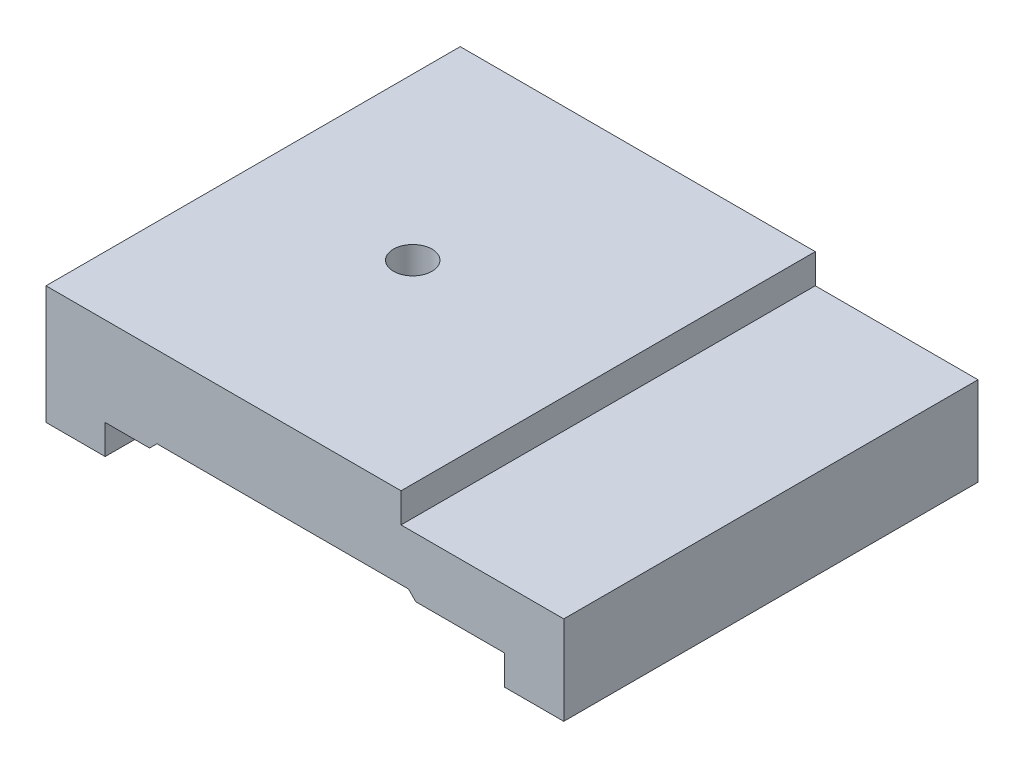
ISO-10303-21;
HEADER;
FILE_DESCRIPTION(('STEP AP214'),'2;1');
FILE_NAME('part.step','',(''),(''),'','','');
FILE_SCHEMA(('AUTOMOTIVE_DESIGN { 1 0 10303 214 1 1 1 1 }'));
ENDSEC;
DATA;
#1=APPLICATION_CONTEXT('core data for automotive mechanical design processes');
#2=APPLICATION_PROTOCOL_DEFINITION('international standard','automotive_design',2000,#1);
#3=PRODUCT_CONTEXT('',#1,'mechanical');
#4=PRODUCT('Part','Part','',(#3));
#5=PRODUCT_RELATED_PRODUCT_CATEGORY('part','',(#4));
#6=PRODUCT_DEFINITION_FORMATION('','',#4);
#7=PRODUCT_DEFINITION_CONTEXT('part definition',#1,'design');
#8=PRODUCT_DEFINITION('design','',#6,#7);
#9=PRODUCT_DEFINITION_SHAPE('','',#8);
#10=(LENGTH_UNIT() NAMED_UNIT(*) SI_UNIT(.MILLI.,.METRE.));
#11=(NAMED_UNIT(*) PLANE_ANGLE_UNIT() SI_UNIT($,.RADIAN.));
#12=(NAMED_UNIT(*) SI_UNIT($,.STERADIAN.) SOLID_ANGLE_UNIT());
#13=UNCERTAINTY_MEASURE_WITH_UNIT(LENGTH_MEASURE(1.E-05),#10,'distance_accuracy_value','');
#14=(GEOMETRIC_REPRESENTATION_CONTEXT(3) GLOBAL_UNCERTAINTY_ASSIGNED_CONTEXT((#13)) GLOBAL_UNIT_ASSIGNED_CONTEXT((#10,
#11,#12)) REPRESENTATION_CONTEXT('',''));
#15=CARTESIAN_POINT('',(0.,0.,0.));
#16=DIRECTION('',(0.,0.,1.));
#17=DIRECTION('',(1.,0.,0.));
#18=AXIS2_PLACEMENT_3D('',#15,#16,#17);
#19=CARTESIAN_POINT('',(0.,0.,0.));
#20=DIRECTION('',(0.,1.,0.));
#21=DIRECTION('',(0.,0.,1.));
#22=AXIS2_PLACEMENT_3D('',#19,#20,#21);
#23=PLANE('',#22);
#24=DIRECTION('',(-1.,0.,0.));
#25=VECTOR('',#24,1.);
#26=CARTESIAN_POINT('',(55.5625,0.,-44.45));
#27=LINE('',#26,#25);
#28=CARTESIAN_POINT('',(-42.8625,0.,-44.45));
#29=VERTEX_POINT('',#28);
#30=CARTESIAN_POINT('',(-55.5625,0.,-44.45));
#31=VERTEX_POINT('',#30);
#32=EDGE_CURVE('E240',#29,#31,#27,.T.);
#33=ORIENTED_EDGE('',*,*,#32,.F.);
#34=DIRECTION('',(0.,0.,1.));
#35=VECTOR('',#34,1.);
#36=CARTESIAN_POINT('',(-42.8625,0.,-44.45));
#37=LINE('',#36,#35);
#38=CARTESIAN_POINT('',(-42.8625,0.,44.45));
#39=VERTEX_POINT('',#38);
#40=EDGE_CURVE('E161',#29,#39,#37,.T.);
#41=ORIENTED_EDGE('',*,*,#40,.T.);
#42=DIRECTION('',(1.,0.,0.));
#43=VECTOR('',#42,1.);
#44=CARTESIAN_POINT('',(55.5625,0.,44.45));
#45=LINE('',#44,#43);
#46=CARTESIAN_POINT('',(-55.5625,0.,44.45));
#47=VERTEX_POINT('',#46);
#48=EDGE_CURVE('E234',#47,#39,#45,.T.);
#49=ORIENTED_EDGE('',*,*,#48,.F.);
#50=DIRECTION('',(0.,0.,1.));
#51=VECTOR('',#50,1.);
#52=CARTESIAN_POINT('',(-55.5625,0.,44.45));
#53=LINE('',#52,#51);
#54=EDGE_CURVE('E163',#31,#47,#53,.T.);
#55=ORIENTED_EDGE('',*,*,#54,.F.);
#56=EDGE_LOOP('',(#33,#41,#49,#55));
#57=FACE_BOUND('',#56,.T.);
#58=ADVANCED_FACE('F34',(#57),#23,.F.);
#59=CARTESIAN_POINT('',(-55.5625,25.4,44.45));
#60=DIRECTION('',(1.,0.,0.));
#61=DIRECTION('',(0.,0.,-1.));
#62=AXIS2_PLACEMENT_3D('',#59,#60,#61);
#63=PLANE('',#62);
#64=ORIENTED_EDGE('',*,*,#54,.T.);
#65=DIRECTION('',(0.,-1.,0.));
#66=VECTOR('',#65,1.);
#67=CARTESIAN_POINT('',(-55.5625,25.4,44.45));
#68=LINE('',#67,#66);
#69=CARTESIAN_POINT('',(-55.5625,25.4,44.45));
#70=VERTEX_POINT('',#69);
#71=EDGE_CURVE('E11',#70,#47,#68,.T.);
#72=ORIENTED_EDGE('',*,*,#71,.F.);
#73=DIRECTION('',(0.,0.,1.));
#74=VECTOR('',#73,1.);
#75=CARTESIAN_POINT('',(-55.5625,25.4,44.45));
#76=LINE('',#75,#74);
#77=CARTESIAN_POINT('',(-55.5625,25.4,-44.45));
#78=VERTEX_POINT('',#77);
#79=EDGE_CURVE('E222',#78,#70,#76,.T.);
#80=ORIENTED_EDGE('',*,*,#79,.F.);
#81=DIRECTION('',(0.,-1.,0.));
#82=VECTOR('',#81,1.);
#83=CARTESIAN_POINT('',(-55.5625,25.4,-44.45));
#84=LINE('',#83,#82);
#85=EDGE_CURVE('E230',#78,#31,#84,.T.);
#86=ORIENTED_EDGE('',*,*,#85,.T.);
#87=EDGE_LOOP('',(#64,#72,#80,#86));
#88=FACE_BOUND('',#87,.T.);
#89=ADVANCED_FACE('F36',(#88),#63,.F.);
#90=CARTESIAN_POINT('',(55.5625,25.4,44.45));
#91=DIRECTION('',(0.,0.,-1.));
#92=DIRECTION('',(-1.,0.,0.));
#93=AXIS2_PLACEMENT_3D('',#90,#91,#92);
#94=PLANE('',#93);
#95=DIRECTION('',(0.,-1.,0.));
#96=VECTOR('',#95,1.);
#97=CARTESIAN_POINT('',(55.5625,25.4,44.45));
#98=LINE('',#97,#96);
#99=CARTESIAN_POINT('',(55.5625,19.05,44.45));
#100=VERTEX_POINT('',#99);
#101=CARTESIAN_POINT('',(55.5625,0.,44.45));
#102=VERTEX_POINT('',#101);
#103=EDGE_CURVE('E42',#100,#102,#98,.T.);
#104=ORIENTED_EDGE('',*,*,#103,.F.);
#105=DIRECTION('',(1.,0.,0.));
#106=VECTOR('',#105,1.);
#107=CARTESIAN_POINT('',(55.5625,19.05,44.45));
#108=LINE('',#107,#106);
#109=CARTESIAN_POINT('',(20.6375,19.05,44.45));
#110=VERTEX_POINT('',#109);
#111=EDGE_CURVE('E154',#110,#100,#108,.T.);
#112=ORIENTED_EDGE('',*,*,#111,.F.);
#113=DIRECTION('',(0.,-1.,0.));
#114=VECTOR('',#113,1.);
#115=CARTESIAN_POINT('',(20.6375,25.4,44.45));
#116=LINE('',#115,#114);
#117=CARTESIAN_POINT('',(20.6375,25.4,44.45));
#118=VERTEX_POINT('',#117);
#119=EDGE_CURVE('E137',#118,#110,#116,.T.);
#120=ORIENTED_EDGE('',*,*,#119,.F.);
#121=DIRECTION('',(1.,0.,0.));
#122=VECTOR('',#121,1.);
#123=CARTESIAN_POINT('',(55.5625,25.4,44.45));
#124=LINE('',#123,#122);
#125=EDGE_CURVE('E225',#70,#118,#124,.T.);
#126=ORIENTED_EDGE('',*,*,#125,.F.);
#127=ORIENTED_EDGE('',*,*,#71,.T.);
#128=ORIENTED_EDGE('',*,*,#48,.T.);
#129=DIRECTION('',(0.,-1.,0.));
#130=VECTOR('',#129,1.);
#131=CARTESIAN_POINT('',(-42.8625,0.,44.45));
#132=LINE('',#131,#130);
#133=CARTESIAN_POINT('',(-42.8625,6.35,44.45));
#134=VERTEX_POINT('',#133);
#135=EDGE_CURVE('E168',#134,#39,#132,.T.);
#136=ORIENTED_EDGE('',*,*,#135,.F.);
#137=DIRECTION('',(-1.,0.,0.));
#138=VECTOR('',#137,1.);
#139=CARTESIAN_POINT('',(-42.8625,6.35,44.45));
#140=LINE('',#139,#138);
#141=CARTESIAN_POINT('',(-33.3375,6.35,44.45));
#142=VERTEX_POINT('',#141);
#143=EDGE_CURVE('E203',#142,#134,#140,.T.);
#144=ORIENTED_EDGE('',*,*,#143,.F.);
#145=DIRECTION('',(-0.707106781186546,-0.707106781186549,0.));
#146=VECTOR('',#145,1.);
#147=CARTESIAN_POINT('',(-33.3375,6.35,44.45));
#148=LINE('',#147,#146);
#149=CARTESIAN_POINT('',(-31.75,7.9375,44.45));
#150=VERTEX_POINT('',#149);
#151=EDGE_CURVE('E200',#150,#142,#148,.T.);
#152=ORIENTED_EDGE('',*,*,#151,.F.);
#153=DIRECTION('',(-1.,0.,0.));
#154=VECTOR('',#153,1.);
#155=CARTESIAN_POINT('',(-31.75,7.9375,44.45));
#156=LINE('',#155,#154);
#157=CARTESIAN_POINT('',(22.225,7.9375,44.45));
#158=VERTEX_POINT('',#157);
#159=EDGE_CURVE('E197',#158,#150,#156,.T.);
#160=ORIENTED_EDGE('',*,*,#159,.F.);
#161=DIRECTION('',(-0.707106781186546,0.707106781186549,0.));
#162=VECTOR('',#161,1.);
#163=CARTESIAN_POINT('',(22.225,7.9375,44.45));
#164=LINE('',#163,#162);
#165=CARTESIAN_POINT('',(23.8125,6.35,44.45));
#166=VERTEX_POINT('',#165);
#167=EDGE_CURVE('E194',#166,#158,#164,.T.);
#168=ORIENTED_EDGE('',*,*,#167,.F.);
#169=DIRECTION('',(-1.,0.,0.));
#170=VECTOR('',#169,1.);
#171=CARTESIAN_POINT('',(23.8125,6.35,44.45));
#172=LINE('',#171,#170);
#173=CARTESIAN_POINT('',(42.8625,6.35,44.45));
#174=VERTEX_POINT('',#173);
#175=EDGE_CURVE('E190',#174,#166,#172,.T.);
#176=ORIENTED_EDGE('',*,*,#175,.F.);
#177=DIRECTION('',(0.,1.,0.));
#178=VECTOR('',#177,1.);
#179=CARTESIAN_POINT('',(42.8625,6.35,44.45));
#180=LINE('',#179,#178);
#181=CARTESIAN_POINT('',(42.8625,0.,44.45));
#182=VERTEX_POINT('',#181);
#183=EDGE_CURVE('E187',#182,#174,#180,.T.);
#184=ORIENTED_EDGE('',*,*,#183,.F.);
#185=EDGE_CURVE('E233',#182,#102,#45,.T.);
#186=ORIENTED_EDGE('',*,*,#185,.T.);
#187=EDGE_LOOP('',(#104,#112,#120,#126,#127,#128,#136,#144,#152,#160,#168,#176,#184,#186));
#188=FACE_BOUND('',#187,.T.);
#189=ADVANCED_FACE('F255',(#188),#94,.F.);
#190=CARTESIAN_POINT('',(55.5625,25.4,44.45));
#191=DIRECTION('',(-1.,0.,0.));
#192=DIRECTION('',(0.,0.,1.));
#193=AXIS2_PLACEMENT_3D('',#190,#191,#192);
#194=PLANE('',#193);
#195=DIRECTION('',(0.,-1.,0.));
#196=VECTOR('',#195,1.);
#197=CARTESIAN_POINT('',(55.5625,25.4,-44.45));
#198=LINE('',#197,#196);
#199=CARTESIAN_POINT('',(55.5625,19.05,-44.45));
#200=VERTEX_POINT('',#199);
#201=CARTESIAN_POINT('',(55.5625,0.,-44.45));
#202=VERTEX_POINT('',#201);
#203=EDGE_CURVE('E245',#200,#202,#198,.T.);
#204=ORIENTED_EDGE('',*,*,#203,.F.);
#205=DIRECTION('',(0.,0.,1.));
#206=VECTOR('',#205,1.);
#207=CARTESIAN_POINT('',(55.5625,19.05,-44.45));
#208=LINE('',#207,#206);
#209=EDGE_CURVE('E140',#200,#100,#208,.T.);
#210=ORIENTED_EDGE('',*,*,#209,.T.);
#211=ORIENTED_EDGE('',*,*,#103,.T.);
#212=DIRECTION('',(0.,0.,-1.));
#213=VECTOR('',#212,1.);
#214=CARTESIAN_POINT('',(55.5625,0.,44.45));
#215=LINE('',#214,#213);
#216=EDGE_CURVE('E237',#102,#202,#215,.T.);
#217=ORIENTED_EDGE('',*,*,#216,.T.);
#218=EDGE_LOOP('',(#204,#210,#211,#217));
#219=FACE_BOUND('',#218,.T.);
#220=ADVANCED_FACE('F249',(#219),#194,.F.);
#221=CARTESIAN_POINT('',(55.5625,25.4,-44.45));
#222=DIRECTION('',(0.,0.,1.));
#223=DIRECTION('',(1.,0.,0.));
#224=AXIS2_PLACEMENT_3D('',#221,#222,#223);
#225=PLANE('',#224);
#226=DIRECTION('',(0.,-1.,0.));
#227=VECTOR('',#226,1.);
#228=CARTESIAN_POINT('',(20.6375,25.4,-44.45));
#229=LINE('',#228,#227);
#230=CARTESIAN_POINT('',(20.6375,25.4,-44.45));
#231=VERTEX_POINT('',#230);
#232=CARTESIAN_POINT('',(20.6375,19.05,-44.45));
#233=VERTEX_POINT('',#232);
#234=EDGE_CURVE('E49',#231,#233,#229,.T.);
#235=ORIENTED_EDGE('',*,*,#234,.T.);
#236=DIRECTION('',(1.,0.,0.));
#237=VECTOR('',#236,1.);
#238=CARTESIAN_POINT('',(55.5625,19.05,-44.45));
#239=LINE('',#238,#237);
#240=EDGE_CURVE('E144',#233,#200,#239,.T.);
#241=ORIENTED_EDGE('',*,*,#240,.T.);
#242=ORIENTED_EDGE('',*,*,#203,.T.);
#243=CARTESIAN_POINT('',(42.8625,0.,-44.45));
#244=VERTEX_POINT('',#243);
#245=EDGE_CURVE('E226',#202,#244,#27,.T.);
#246=ORIENTED_EDGE('',*,*,#245,.T.);
#247=DIRECTION('',(0.,1.,0.));
#248=VECTOR('',#247,1.);
#249=CARTESIAN_POINT('',(42.8625,6.35,-44.45));
#250=LINE('',#249,#248);
#251=CARTESIAN_POINT('',(42.8625,6.35,-44.45));
#252=VERTEX_POINT('',#251);
#253=EDGE_CURVE('E57',#244,#252,#250,.T.);
#254=ORIENTED_EDGE('',*,*,#253,.T.);
#255=DIRECTION('',(-1.,0.,0.));
#256=VECTOR('',#255,1.);
#257=CARTESIAN_POINT('',(23.8125,6.35,-44.45));
#258=LINE('',#257,#256);
#259=CARTESIAN_POINT('',(23.8125,6.35,-44.45));
#260=VERTEX_POINT('',#259);
#261=EDGE_CURVE('E167',#252,#260,#258,.T.);
#262=ORIENTED_EDGE('',*,*,#261,.T.);
#263=DIRECTION('',(-0.707106781186546,0.707106781186549,0.));
#264=VECTOR('',#263,1.);
#265=CARTESIAN_POINT('',(22.225,7.9375,-44.45));
#266=LINE('',#265,#264);
#267=CARTESIAN_POINT('',(22.225,7.9375,-44.45));
#268=VERTEX_POINT('',#267);
#269=EDGE_CURVE('E171',#260,#268,#266,.T.);
#270=ORIENTED_EDGE('',*,*,#269,.T.);
#271=DIRECTION('',(-1.,0.,0.));
#272=VECTOR('',#271,1.);
#273=CARTESIAN_POINT('',(-31.75,7.9375,-44.45));
#274=LINE('',#273,#272);
#275=CARTESIAN_POINT('',(-31.75,7.9375,-44.45));
#276=VERTEX_POINT('',#275);
#277=EDGE_CURVE('E174',#268,#276,#274,.T.);
#278=ORIENTED_EDGE('',*,*,#277,.T.);
#279=DIRECTION('',(-0.707106781186546,-0.707106781186549,0.));
#280=VECTOR('',#279,1.);
#281=CARTESIAN_POINT('',(-33.3375,6.35,-44.45));
#282=LINE('',#281,#280);
#283=CARTESIAN_POINT('',(-33.3375,6.35,-44.45));
#284=VERTEX_POINT('',#283);
#285=EDGE_CURVE('E177',#276,#284,#282,.T.);
#286=ORIENTED_EDGE('',*,*,#285,.T.);
#287=DIRECTION('',(-1.,0.,0.));
#288=VECTOR('',#287,1.);
#289=CARTESIAN_POINT('',(-42.8625,6.35,-44.45));
#290=LINE('',#289,#288);
#291=CARTESIAN_POINT('',(-42.8625,6.35,-44.45));
#292=VERTEX_POINT('',#291);
#293=EDGE_CURVE('E180',#284,#292,#290,.T.);
#294=ORIENTED_EDGE('',*,*,#293,.T.);
#295=DIRECTION('',(0.,-1.,0.));
#296=VECTOR('',#295,1.);
#297=CARTESIAN_POINT('',(-42.8625,0.,-44.45));
#298=LINE('',#297,#296);
#299=EDGE_CURVE('E183',#292,#29,#298,.T.);
#300=ORIENTED_EDGE('',*,*,#299,.T.);
#301=ORIENTED_EDGE('',*,*,#32,.T.);
#302=ORIENTED_EDGE('',*,*,#85,.F.);
#303=DIRECTION('',(-1.,0.,0.));
#304=VECTOR('',#303,1.);
#305=CARTESIAN_POINT('',(55.5625,25.4,-44.45));
#306=LINE('',#305,#304);
#307=EDGE_CURVE('E153',#231,#78,#306,.T.);
#308=ORIENTED_EDGE('',*,*,#307,.F.);
#309=EDGE_LOOP('',(#235,#241,#242,#246,#254,#262,#270,#278,#286,#294,#300,#301,#302,#308));
#310=FACE_BOUND('',#309,.T.);
#311=ADVANCED_FACE('F151',(#310),#225,.F.);
#312=CARTESIAN_POINT('',(0.,25.4,0.));
#313=DIRECTION('',(0.,1.,0.));
#314=DIRECTION('',(0.,0.,1.));
#315=AXIS2_PLACEMENT_3D('',#312,#313,#314);
#316=PLANE('',#315);
#317=CARTESIAN_POINT('',(-20.9627113131643,25.4,0.340703289912901));
#318=DIRECTION('',(0.,-1.,0.));
#319=DIRECTION('',(0.,0.,-1.));
#320=AXIS2_PLACEMENT_3D('',#317,#318,#319);
#321=CIRCLE('',#320,4.13258);
#322=CARTESIAN_POINT('',(-20.9627113131643,25.4,-3.7918767100871));
#323=VERTEX_POINT('',#322);
#324=EDGE_CURVE('E191',#323,#323,#321,.T.);
#325=ORIENTED_EDGE('',*,*,#324,.T.);
#326=EDGE_LOOP('',(#325));
#327=FACE_BOUND('',#326,.T.);
#328=DIRECTION('',(0.,0.,1.));
#329=VECTOR('',#328,1.);
#330=CARTESIAN_POINT('',(20.6375,25.4,-44.45));
#331=LINE('',#330,#329);
#332=EDGE_CURVE('E141',#231,#118,#331,.T.);
#333=ORIENTED_EDGE('',*,*,#332,.F.);
#334=ORIENTED_EDGE('',*,*,#307,.T.);
#335=ORIENTED_EDGE('',*,*,#79,.T.);
#336=ORIENTED_EDGE('',*,*,#125,.T.);
#337=EDGE_LOOP('',(#333,#334,#335,#336));
#338=FACE_BOUND('',#337,.T.);
#339=ADVANCED_FACE('F289',(#327,#338),#316,.T.);
#340=ORIENTED_EDGE('',*,*,#185,.F.);
#341=DIRECTION('',(0.,0.,1.));
#342=VECTOR('',#341,1.);
#343=CARTESIAN_POINT('',(42.8625,0.,-44.45));
#344=LINE('',#343,#342);
#345=EDGE_CURVE('E186',#244,#182,#344,.T.);
#346=ORIENTED_EDGE('',*,*,#345,.F.);
#347=ORIENTED_EDGE('',*,*,#245,.F.);
#348=ORIENTED_EDGE('',*,*,#216,.F.);
#349=EDGE_LOOP('',(#340,#346,#347,#348));
#350=FACE_BOUND('',#349,.T.);
#351=ADVANCED_FACE('F258',(#350),#23,.F.);
#352=CARTESIAN_POINT('',(-42.8625,0.,-44.45));
#353=DIRECTION('',(-1.,0.,0.));
#354=DIRECTION('',(0.,0.,1.));
#355=AXIS2_PLACEMENT_3D('',#352,#353,#354);
#356=PLANE('',#355);
#357=ORIENTED_EDGE('',*,*,#135,.T.);
#358=ORIENTED_EDGE('',*,*,#40,.F.);
#359=ORIENTED_EDGE('',*,*,#299,.F.);
#360=DIRECTION('',(0.,0.,1.));
#361=VECTOR('',#360,1.);
#362=CARTESIAN_POINT('',(-42.8625,6.35,-44.45));
#363=LINE('',#362,#361);
#364=EDGE_CURVE('E209',#292,#134,#363,.T.);
#365=ORIENTED_EDGE('',*,*,#364,.T.);
#366=EDGE_LOOP('',(#357,#358,#359,#365));
#367=FACE_BOUND('',#366,.T.);
#368=ADVANCED_FACE('F281',(#367),#356,.F.);
#369=CARTESIAN_POINT('',(-42.8625,6.35,-44.45));
#370=DIRECTION('',(0.,1.,0.));
#371=DIRECTION('',(0.,0.,1.));
#372=AXIS2_PLACEMENT_3D('',#369,#370,#371);
#373=PLANE('',#372);
#374=ORIENTED_EDGE('',*,*,#143,.T.);
#375=ORIENTED_EDGE('',*,*,#364,.F.);
#376=ORIENTED_EDGE('',*,*,#293,.F.);
#377=DIRECTION('',(0.,0.,1.));
#378=VECTOR('',#377,1.);
#379=CARTESIAN_POINT('',(-33.3375,6.35,-44.45));
#380=LINE('',#379,#378);
#381=EDGE_CURVE('E211',#284,#142,#380,.T.);
#382=ORIENTED_EDGE('',*,*,#381,.T.);
#383=EDGE_LOOP('',(#374,#375,#376,#382));
#384=FACE_BOUND('',#383,.T.);
#385=ADVANCED_FACE('F277',(#384),#373,.F.);
#386=CARTESIAN_POINT('',(-33.3375,6.35,-44.45));
#387=DIRECTION('',(-0.707106781186549,0.707106781186545,0.));
#388=DIRECTION('',(-0.707106781186546,-0.707106781186549,0.));
#389=AXIS2_PLACEMENT_3D('',#386,#387,#388);
#390=PLANE('',#389);
#391=ORIENTED_EDGE('',*,*,#151,.T.);
#392=ORIENTED_EDGE('',*,*,#381,.F.);
#393=ORIENTED_EDGE('',*,*,#285,.F.);
#394=DIRECTION('',(0.,0.,1.));
#395=VECTOR('',#394,1.);
#396=CARTESIAN_POINT('',(-31.75,7.9375,-44.45));
#397=LINE('',#396,#395);
#398=EDGE_CURVE('E213',#276,#150,#397,.T.);
#399=ORIENTED_EDGE('',*,*,#398,.T.);
#400=EDGE_LOOP('',(#391,#392,#393,#399));
#401=FACE_BOUND('',#400,.T.);
#402=ADVANCED_FACE('F273',(#401),#390,.F.);
#403=CARTESIAN_POINT('',(-31.75,7.9375,-44.45));
#404=DIRECTION('',(0.,1.,0.));
#405=DIRECTION('',(0.,0.,1.));
#406=AXIS2_PLACEMENT_3D('',#403,#404,#405);
#407=PLANE('',#406);
#408=CARTESIAN_POINT('',(-20.9627113131643,7.9375,0.340703289912901));
#409=DIRECTION('',(0.,-1.,0.));
#410=DIRECTION('',(0.,0.,-1.));
#411=AXIS2_PLACEMENT_3D('',#408,#409,#410);
#412=CIRCLE('',#411,4.13258);
#413=CARTESIAN_POINT('',(-20.9627113131643,7.9375,-3.7918767100871));
#414=VERTEX_POINT('',#413);
#415=EDGE_CURVE('E158',#414,#414,#412,.T.);
#416=ORIENTED_EDGE('',*,*,#415,.F.);
#417=EDGE_LOOP('',(#416));
#418=FACE_BOUND('',#417,.T.);
#419=ORIENTED_EDGE('',*,*,#159,.T.);
#420=ORIENTED_EDGE('',*,*,#398,.F.);
#421=ORIENTED_EDGE('',*,*,#277,.F.);
#422=DIRECTION('',(0.,0.,1.));
#423=VECTOR('',#422,1.);
#424=CARTESIAN_POINT('',(22.225,7.9375,-44.45));
#425=LINE('',#424,#423);
#426=EDGE_CURVE('E215',#268,#158,#425,.T.);
#427=ORIENTED_EDGE('',*,*,#426,.T.);
#428=EDGE_LOOP('',(#419,#420,#421,#427));
#429=FACE_BOUND('',#428,.T.);
#430=ADVANCED_FACE('F269',(#418,#429),#407,.F.);
#431=CARTESIAN_POINT('',(22.225,7.9375,-44.45));
#432=DIRECTION('',(0.707106781186549,0.707106781186546,0.));
#433=DIRECTION('',(-0.707106781186546,0.707106781186549,0.));
#434=AXIS2_PLACEMENT_3D('',#431,#432,#433);
#435=PLANE('',#434);
#436=ORIENTED_EDGE('',*,*,#167,.T.);
#437=ORIENTED_EDGE('',*,*,#426,.F.);
#438=ORIENTED_EDGE('',*,*,#269,.F.);
#439=DIRECTION('',(0.,0.,1.));
#440=VECTOR('',#439,1.);
#441=CARTESIAN_POINT('',(23.8125,6.35,-44.45));
#442=LINE('',#441,#440);
#443=EDGE_CURVE('E217',#260,#166,#442,.T.);
#444=ORIENTED_EDGE('',*,*,#443,.T.);
#445=EDGE_LOOP('',(#436,#437,#438,#444));
#446=FACE_BOUND('',#445,.T.);
#447=ADVANCED_FACE('F265',(#446),#435,.F.);
#448=CARTESIAN_POINT('',(23.8125,6.35,-44.45));
#449=DIRECTION('',(0.,1.,0.));
#450=DIRECTION('',(-1.,0.,0.));
#451=AXIS2_PLACEMENT_3D('',#448,#449,#450);
#452=PLANE('',#451);
#453=ORIENTED_EDGE('',*,*,#175,.T.);
#454=ORIENTED_EDGE('',*,*,#443,.F.);
#455=ORIENTED_EDGE('',*,*,#261,.F.);
#456=DIRECTION('',(0.,0.,1.));
#457=VECTOR('',#456,1.);
#458=CARTESIAN_POINT('',(42.8625,6.35,-44.45));
#459=LINE('',#458,#457);
#460=EDGE_CURVE('E219',#252,#174,#459,.T.);
#461=ORIENTED_EDGE('',*,*,#460,.T.);
#462=EDGE_LOOP('',(#453,#454,#455,#461));
#463=FACE_BOUND('',#462,.T.);
#464=ADVANCED_FACE('F262',(#463),#452,.F.);
#465=CARTESIAN_POINT('',(42.8625,6.35,-44.45));
#466=DIRECTION('',(1.,0.,0.));
#467=DIRECTION('',(0.,1.,0.));
#468=AXIS2_PLACEMENT_3D('',#465,#466,#467);
#469=PLANE('',#468);
#470=ORIENTED_EDGE('',*,*,#183,.T.);
#471=ORIENTED_EDGE('',*,*,#460,.F.);
#472=ORIENTED_EDGE('',*,*,#253,.F.);
#473=ORIENTED_EDGE('',*,*,#345,.T.);
#474=EDGE_LOOP('',(#470,#471,#472,#473));
#475=FACE_BOUND('',#474,.T.);
#476=ADVANCED_FACE('F371',(#475),#469,.F.);
#477=CARTESIAN_POINT('',(55.5625,19.05,-44.45));
#478=DIRECTION('',(0.,-1.,0.));
#479=DIRECTION('',(1.,0.,0.));
#480=AXIS2_PLACEMENT_3D('',#477,#478,#479);
#481=PLANE('',#480);
#482=ORIENTED_EDGE('',*,*,#111,.T.);
#483=ORIENTED_EDGE('',*,*,#209,.F.);
#484=ORIENTED_EDGE('',*,*,#240,.F.);
#485=DIRECTION('',(0.,0.,1.));
#486=VECTOR('',#485,1.);
#487=CARTESIAN_POINT('',(20.6375,19.05,-44.45));
#488=LINE('',#487,#486);
#489=EDGE_CURVE('E133',#233,#110,#488,.T.);
#490=ORIENTED_EDGE('',*,*,#489,.T.);
#491=EDGE_LOOP('',(#482,#483,#484,#490));
#492=FACE_BOUND('',#491,.T.);
#493=ADVANCED_FACE('F145',(#492),#481,.F.);
#494=CARTESIAN_POINT('',(20.6375,25.4,-44.45));
#495=DIRECTION('',(-1.,0.,0.));
#496=DIRECTION('',(0.,-1.,0.));
#497=AXIS2_PLACEMENT_3D('',#494,#495,#496);
#498=PLANE('',#497);
#499=ORIENTED_EDGE('',*,*,#119,.T.);
#500=ORIENTED_EDGE('',*,*,#489,.F.);
#501=ORIENTED_EDGE('',*,*,#234,.F.);
#502=ORIENTED_EDGE('',*,*,#332,.T.);
#503=EDGE_LOOP('',(#499,#500,#501,#502));
#504=FACE_BOUND('',#503,.T.);
#505=ADVANCED_FACE('F135',(#504),#498,.F.);
#506=CARTESIAN_POINT('',(-20.9627113131643,25.4,0.340703289912901));
#507=DIRECTION('',(0.,-1.,0.));
#508=DIRECTION('',(0.,0.,-1.));
#509=AXIS2_PLACEMENT_3D('',#506,#507,#508);
#510=CYLINDRICAL_SURFACE('',#509,4.13258);
#511=ORIENTED_EDGE('',*,*,#324,.F.);
#512=EDGE_LOOP('',(#511));
#513=FACE_BOUND('',#512,.T.);
#514=ORIENTED_EDGE('',*,*,#415,.T.);
#515=EDGE_LOOP('',(#514));
#516=FACE_BOUND('',#515,.T.);
#517=ADVANCED_FACE('F394',(#513,#516),#510,.F.);
#518=CLOSED_SHELL('',(#58,#89,#189,#220,#311,#339,#351,#368,#385,#402,#430,#447,#464,#476,#493,
#505,#517));
#519=MANIFOLD_SOLID_BREP('B2',#518);
#520=ADVANCED_BREP_SHAPE_REPRESENTATION('',(#18,#519),#14);
#521=SHAPE_DEFINITION_REPRESENTATION(#9,#520);
ENDSEC;
END-ISO-10303-21;
